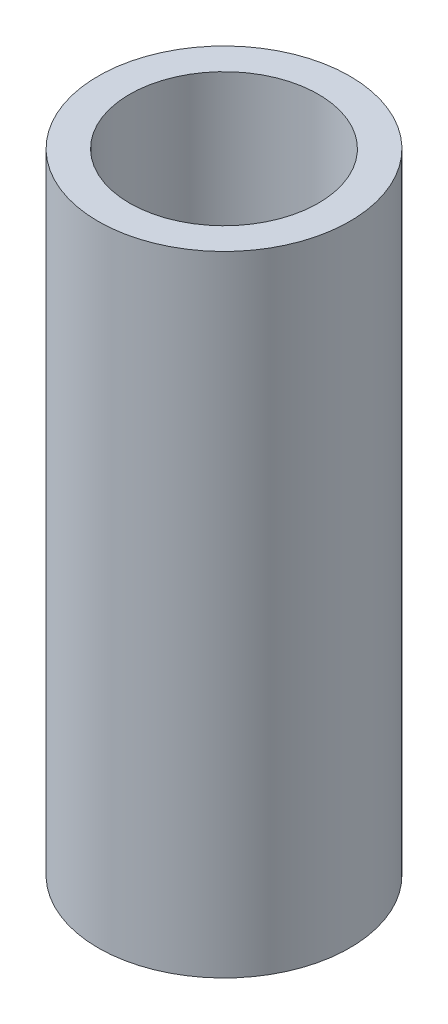
ISO-10303-21;
HEADER;
FILE_DESCRIPTION(('STEP AP214'),'2;1');
FILE_NAME('part.step','',(''),(''),'','','');
FILE_SCHEMA(('AUTOMOTIVE_DESIGN { 1 0 10303 214 1 1 1 1 }'));
ENDSEC;
DATA;
#1=APPLICATION_CONTEXT('core data for automotive mechanical design processes');
#2=APPLICATION_PROTOCOL_DEFINITION('international standard','automotive_design',2000,#1);
#3=PRODUCT_CONTEXT('',#1,'mechanical');
#4=PRODUCT('Part','Part','',(#3));
#5=PRODUCT_RELATED_PRODUCT_CATEGORY('part','',(#4));
#6=PRODUCT_DEFINITION_FORMATION('','',#4);
#7=PRODUCT_DEFINITION_CONTEXT('part definition',#1,'design');
#8=PRODUCT_DEFINITION('design','',#6,#7);
#9=PRODUCT_DEFINITION_SHAPE('','',#8);
#10=(LENGTH_UNIT() NAMED_UNIT(*) SI_UNIT(.MILLI.,.METRE.));
#11=(NAMED_UNIT(*) PLANE_ANGLE_UNIT() SI_UNIT($,.RADIAN.));
#12=(NAMED_UNIT(*) SI_UNIT($,.STERADIAN.) SOLID_ANGLE_UNIT());
#13=UNCERTAINTY_MEASURE_WITH_UNIT(LENGTH_MEASURE(1.E-05),#10,'distance_accuracy_value','');
#14=(GEOMETRIC_REPRESENTATION_CONTEXT(3) GLOBAL_UNCERTAINTY_ASSIGNED_CONTEXT((#13)) GLOBAL_UNIT_ASSIGNED_CONTEXT((#10,
#11,#12)) REPRESENTATION_CONTEXT('',''));
#15=CARTESIAN_POINT('',(0.,0.,0.));
#16=DIRECTION('',(0.,0.,1.));
#17=DIRECTION('',(1.,0.,0.));
#18=AXIS2_PLACEMENT_3D('',#15,#16,#17);
#19=CARTESIAN_POINT('',(0.,10.,0.));
#20=DIRECTION('',(0.,1.,0.));
#21=DIRECTION('',(0.,0.,1.));
#22=AXIS2_PLACEMENT_3D('',#19,#20,#21);
#23=PLANE('',#22);
#24=CARTESIAN_POINT('',(0.,10.,0.));
#25=DIRECTION('',(0.,1.,0.));
#26=DIRECTION('',(0.,0.,1.));
#27=AXIS2_PLACEMENT_3D('',#24,#25,#26);
#28=CIRCLE('',#27,2.);
#29=CARTESIAN_POINT('',(0.,10.,2.));
#30=VERTEX_POINT('',#29);
#31=EDGE_CURVE('E10',#30,#30,#28,.T.);
#32=ORIENTED_EDGE('',*,*,#31,.T.);
#33=EDGE_LOOP('',(#32));
#34=FACE_BOUND('',#33,.T.);
#35=CARTESIAN_POINT('',(0.,10.,0.));
#36=DIRECTION('',(0.,1.,0.));
#37=DIRECTION('',(0.,0.,1.));
#38=AXIS2_PLACEMENT_3D('',#35,#36,#37);
#39=CIRCLE('',#38,1.5);
#40=CARTESIAN_POINT('',(0.,10.,1.5));
#41=VERTEX_POINT('',#40);
#42=EDGE_CURVE('E56',#41,#41,#39,.T.);
#43=ORIENTED_EDGE('',*,*,#42,.F.);
#44=EDGE_LOOP('',(#43));
#45=FACE_BOUND('',#44,.T.);
#46=ADVANCED_FACE('F43',(#34,#45),#23,.T.);
#47=CARTESIAN_POINT('',(0.,0.,0.));
#48=DIRECTION('',(0.,1.,0.));
#49=DIRECTION('',(0.,0.,1.));
#50=AXIS2_PLACEMENT_3D('',#47,#48,#49);
#51=PLANE('',#50);
#52=CARTESIAN_POINT('',(0.,0.,0.));
#53=DIRECTION('',(0.,1.,0.));
#54=DIRECTION('',(0.,0.,1.));
#55=AXIS2_PLACEMENT_3D('',#52,#53,#54);
#56=CIRCLE('',#55,2.);
#57=CARTESIAN_POINT('',(0.,0.,2.));
#58=VERTEX_POINT('',#57);
#59=EDGE_CURVE('E47',#58,#58,#56,.T.);
#60=ORIENTED_EDGE('',*,*,#59,.F.);
#61=EDGE_LOOP('',(#60));
#62=FACE_BOUND('',#61,.T.);
#63=CARTESIAN_POINT('',(0.,0.,0.));
#64=DIRECTION('',(0.,1.,0.));
#65=DIRECTION('',(0.,0.,1.));
#66=AXIS2_PLACEMENT_3D('',#63,#64,#65);
#67=CIRCLE('',#66,1.5);
#68=CARTESIAN_POINT('',(0.,0.,1.5));
#69=VERTEX_POINT('',#68);
#70=EDGE_CURVE('E58',#69,#69,#67,.T.);
#71=ORIENTED_EDGE('',*,*,#70,.T.);
#72=EDGE_LOOP('',(#71));
#73=FACE_BOUND('',#72,.T.);
#74=ADVANCED_FACE('F70',(#62,#73),#51,.F.);
#75=CARTESIAN_POINT('',(0.,10.,0.));
#76=DIRECTION('',(0.,-1.,0.));
#77=DIRECTION('',(0.,0.,-1.));
#78=AXIS2_PLACEMENT_3D('',#75,#76,#77);
#79=CYLINDRICAL_SURFACE('',#78,2.);
#80=ORIENTED_EDGE('',*,*,#31,.F.);
#81=EDGE_LOOP('',(#80));
#82=FACE_BOUND('',#81,.T.);
#83=ORIENTED_EDGE('',*,*,#59,.T.);
#84=EDGE_LOOP('',(#83));
#85=FACE_BOUND('',#84,.T.);
#86=ADVANCED_FACE('F45',(#82,#85),#79,.T.);
#87=CARTESIAN_POINT('',(0.,10.,0.));
#88=DIRECTION('',(0.,-1.,0.));
#89=DIRECTION('',(0.,0.,-1.));
#90=AXIS2_PLACEMENT_3D('',#87,#88,#89);
#91=CYLINDRICAL_SURFACE('',#90,1.5);
#92=ORIENTED_EDGE('',*,*,#42,.T.);
#93=EDGE_LOOP('',(#92));
#94=FACE_BOUND('',#93,.T.);
#95=ORIENTED_EDGE('',*,*,#70,.F.);
#96=EDGE_LOOP('',(#95));
#97=FACE_BOUND('',#96,.T.);
#98=ADVANCED_FACE('F66',(#94,#97),#91,.F.);
#99=CLOSED_SHELL('',(#46,#74,#86,#98));
#100=MANIFOLD_SOLID_BREP('B2',#99);
#101=ADVANCED_BREP_SHAPE_REPRESENTATION('',(#18,#100),#14);
#102=SHAPE_DEFINITION_REPRESENTATION(#9,#101);
ENDSEC;
END-ISO-10303-21;
